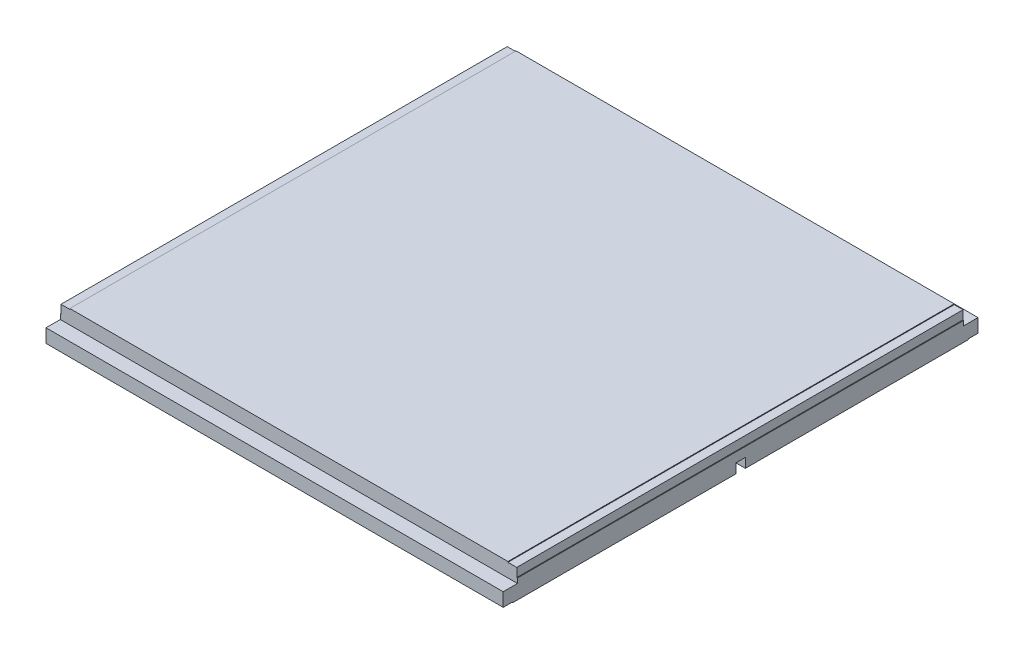
ISO-10303-21;
HEADER;
FILE_DESCRIPTION(('STEP AP214'),'2;1');
FILE_NAME('part.step','',(''),(''),'','','');
FILE_SCHEMA(('AUTOMOTIVE_DESIGN { 1 0 10303 214 1 1 1 1 }'));
ENDSEC;
DATA;
#1=APPLICATION_CONTEXT('core data for automotive mechanical design processes');
#2=APPLICATION_PROTOCOL_DEFINITION('international standard','automotive_design',2000,#1);
#3=PRODUCT_CONTEXT('',#1,'mechanical');
#4=PRODUCT('Part','Part','',(#3));
#5=PRODUCT_RELATED_PRODUCT_CATEGORY('part','',(#4));
#6=PRODUCT_DEFINITION_FORMATION('','',#4);
#7=PRODUCT_DEFINITION_CONTEXT('part definition',#1,'design');
#8=PRODUCT_DEFINITION('design','',#6,#7);
#9=PRODUCT_DEFINITION_SHAPE('','',#8);
#10=(LENGTH_UNIT() NAMED_UNIT(*) SI_UNIT(.MILLI.,.METRE.));
#11=(NAMED_UNIT(*) PLANE_ANGLE_UNIT() SI_UNIT($,.RADIAN.));
#12=(NAMED_UNIT(*) SI_UNIT($,.STERADIAN.) SOLID_ANGLE_UNIT());
#13=UNCERTAINTY_MEASURE_WITH_UNIT(LENGTH_MEASURE(1.E-05),#10,'distance_accuracy_value','');
#14=(GEOMETRIC_REPRESENTATION_CONTEXT(3) GLOBAL_UNCERTAINTY_ASSIGNED_CONTEXT((#13)) GLOBAL_UNIT_ASSIGNED_CONTEXT((#10,
#11,#12)) REPRESENTATION_CONTEXT('',''));
#15=CARTESIAN_POINT('',(0.,0.,0.));
#16=DIRECTION('',(0.,0.,1.));
#17=DIRECTION('',(1.,0.,0.));
#18=AXIS2_PLACEMENT_3D('',#15,#16,#17);
#19=CARTESIAN_POINT('',(960.,120.,-997.));
#20=DIRECTION('',(-1.,0.,0.));
#21=DIRECTION('',(0.,0.,1.));
#22=AXIS2_PLACEMENT_3D('',#19,#20,#21);
#23=PLANE('',#22);
#24=DIRECTION('',(0.,0.,1.));
#25=VECTOR('',#24,1.);
#26=CARTESIAN_POINT('',(960.,80.,937.000000000001));
#27=LINE('',#26,#25);
#28=CARTESIAN_POINT('',(960.,80.,-936.999999999999));
#29=VERTEX_POINT('',#28);
#30=CARTESIAN_POINT('',(960.,80.,937.000000000001));
#31=VERTEX_POINT('',#30);
#32=EDGE_CURVE('E216',#29,#31,#27,.T.);
#33=ORIENTED_EDGE('',*,*,#32,.T.);
#34=DIRECTION('',(0.,-1.,0.));
#35=VECTOR('',#34,1.);
#36=CARTESIAN_POINT('',(960.000000000001,120.,937.));
#37=LINE('',#36,#35);
#38=CARTESIAN_POINT('',(960.000000000001,60.,937.));
#39=VERTEX_POINT('',#38);
#40=EDGE_CURVE('E221',#31,#39,#37,.T.);
#41=ORIENTED_EDGE('',*,*,#40,.T.);
#42=DIRECTION('',(0.,0.,1.));
#43=VECTOR('',#42,1.);
#44=CARTESIAN_POINT('',(960.000000000001,60.,997.));
#45=LINE('',#44,#43);
#46=CARTESIAN_POINT('',(960.000000000001,60.,997.));
#47=VERTEX_POINT('',#46);
#48=EDGE_CURVE('E403',#39,#47,#45,.T.);
#49=ORIENTED_EDGE('',*,*,#48,.T.);
#50=DIRECTION('',(0.,-1.,0.));
#51=VECTOR('',#50,1.);
#52=CARTESIAN_POINT('',(960.,120.,997.));
#53=LINE('',#52,#51);
#54=CARTESIAN_POINT('',(960.,3.,997.));
#55=VERTEX_POINT('',#54);
#56=EDGE_CURVE('E438',#47,#55,#53,.T.);
#57=ORIENTED_EDGE('',*,*,#56,.T.);
#58=DIRECTION('',(0.,0.,1.));
#59=VECTOR('',#58,1.);
#60=CARTESIAN_POINT('',(960.,3.,957.000000000001));
#61=LINE('',#60,#59);
#62=CARTESIAN_POINT('',(960.,3.,957.000000000001));
#63=VERTEX_POINT('',#62);
#64=EDGE_CURVE('E323',#63,#55,#61,.T.);
#65=ORIENTED_EDGE('',*,*,#64,.F.);
#66=DIRECTION('',(0.,-1.,0.));
#67=VECTOR('',#66,1.);
#68=CARTESIAN_POINT('',(960.,3.,957.000000000001));
#69=LINE('',#68,#67);
#70=CARTESIAN_POINT('',(960.,0.,957.000000000001));
#71=VERTEX_POINT('',#70);
#72=EDGE_CURVE('E307',#63,#71,#69,.T.);
#73=ORIENTED_EDGE('',*,*,#72,.T.);
#74=DIRECTION('',(0.,0.,-1.));
#75=VECTOR('',#74,1.);
#76=CARTESIAN_POINT('',(960.,0.,-997.));
#77=LINE('',#76,#75);
#78=CARTESIAN_POINT('',(960.,0.,20.0000000000004));
#79=VERTEX_POINT('',#78);
#80=EDGE_CURVE('E427',#71,#79,#77,.T.);
#81=ORIENTED_EDGE('',*,*,#80,.T.);
#82=DIRECTION('',(0.,1.,0.));
#83=VECTOR('',#82,1.);
#84=CARTESIAN_POINT('',(960.000000000001,0.,20.0000000000003));
#85=LINE('',#84,#83);
#86=CARTESIAN_POINT('',(960.000000000001,40.,20.0000000000003));
#87=VERTEX_POINT('',#86);
#88=EDGE_CURVE('E340',#79,#87,#85,.T.);
#89=ORIENTED_EDGE('',*,*,#88,.T.);
#90=DIRECTION('',(0.,0.,1.));
#91=VECTOR('',#90,1.);
#92=CARTESIAN_POINT('',(960.000000000001,40.,-2.65554844650516E-13));
#93=LINE('',#92,#91);
#94=CARTESIAN_POINT('',(960.000000000001,40.,-19.9999999999997));
#95=VERTEX_POINT('',#94);
#96=EDGE_CURVE('E345',#95,#87,#93,.T.);
#97=ORIENTED_EDGE('',*,*,#96,.F.);
#98=DIRECTION('',(0.,1.,0.));
#99=VECTOR('',#98,1.);
#100=CARTESIAN_POINT('',(960.000000000001,0.,-19.9999999999997));
#101=LINE('',#100,#99);
#102=CARTESIAN_POINT('',(960.000000000001,0.,-19.9999999999997));
#103=VERTEX_POINT('',#102);
#104=EDGE_CURVE('E337',#103,#95,#101,.T.);
#105=ORIENTED_EDGE('',*,*,#104,.F.);
#106=CARTESIAN_POINT('',(960.,0.,-957.));
#107=VERTEX_POINT('',#106);
#108=EDGE_CURVE('E426',#103,#107,#77,.T.);
#109=ORIENTED_EDGE('',*,*,#108,.T.);
#110=DIRECTION('',(0.,-1.,0.));
#111=VECTOR('',#110,1.);
#112=CARTESIAN_POINT('',(960.,3.,-957.));
#113=LINE('',#112,#111);
#114=CARTESIAN_POINT('',(960.,3.,-957.));
#115=VERTEX_POINT('',#114);
#116=EDGE_CURVE('E304',#115,#107,#113,.T.);
#117=ORIENTED_EDGE('',*,*,#116,.F.);
#118=DIRECTION('',(0.,0.,1.));
#119=VECTOR('',#118,1.);
#120=CARTESIAN_POINT('',(960.,3.,-957.));
#121=LINE('',#120,#119);
#122=CARTESIAN_POINT('',(960.,3.,-997.));
#123=VERTEX_POINT('',#122);
#124=EDGE_CURVE('E289',#123,#115,#121,.T.);
#125=ORIENTED_EDGE('',*,*,#124,.F.);
#126=DIRECTION('',(0.,-1.,0.));
#127=VECTOR('',#126,1.);
#128=CARTESIAN_POINT('',(960.,120.,-997.));
#129=LINE('',#128,#127);
#130=CARTESIAN_POINT('',(960.,59.9999999999996,-997.));
#131=VERTEX_POINT('',#130);
#132=EDGE_CURVE('E434',#131,#123,#129,.T.);
#133=ORIENTED_EDGE('',*,*,#132,.F.);
#134=DIRECTION('',(0.,0.,1.));
#135=VECTOR('',#134,1.);
#136=CARTESIAN_POINT('',(960.,59.9999999999996,-997.));
#137=LINE('',#136,#135);
#138=CARTESIAN_POINT('',(960.,60.,-937.));
#139=VERTEX_POINT('',#138);
#140=EDGE_CURVE('E373',#131,#139,#137,.T.);
#141=ORIENTED_EDGE('',*,*,#140,.T.);
#142=DIRECTION('',(0.,1.,0.));
#143=VECTOR('',#142,1.);
#144=CARTESIAN_POINT('',(960.,120.,-937.));
#145=LINE('',#144,#143);
#146=EDGE_CURVE('E377',#139,#29,#145,.T.);
#147=ORIENTED_EDGE('',*,*,#146,.T.);
#148=EDGE_LOOP('',(#33,#41,#49,#57,#65,#73,#81,#89,#97,#105,#109,#117,#125,#133,#141,#147));
#149=FACE_BOUND('',#148,.T.);
#150=ADVANCED_FACE('F38',(#149),#23,.F.);
#151=CARTESIAN_POINT('',(960.000000000001,120.,937.));
#152=DIRECTION('',(0.,0.,-1.));
#153=DIRECTION('',(0.,1.,0.));
#154=AXIS2_PLACEMENT_3D('',#151,#152,#153);
#155=PLANE('',#154);
#156=DIRECTION('',(1.,0.,0.));
#157=VECTOR('',#156,1.);
#158=CARTESIAN_POINT('',(957.,80.,937.000000000001));
#159=LINE('',#158,#157);
#160=CARTESIAN_POINT('',(957.,80.,937.000000000001));
#161=VERTEX_POINT('',#160);
#162=EDGE_CURVE('E203',#161,#31,#159,.T.);
#163=ORIENTED_EDGE('',*,*,#162,.F.);
#164=DIRECTION('',(0.,1.,0.));
#165=VECTOR('',#164,1.);
#166=CARTESIAN_POINT('',(957.,120.,937.000000000001));
#167=LINE('',#166,#165);
#168=CARTESIAN_POINT('',(957.,117.,937.000000000001));
#169=VERTEX_POINT('',#168);
#170=EDGE_CURVE('E208',#161,#169,#167,.T.);
#171=ORIENTED_EDGE('',*,*,#170,.T.);
#172=DIRECTION('',(1.,0.,0.));
#173=VECTOR('',#172,1.);
#174=CARTESIAN_POINT('',(920.,117.,937.));
#175=LINE('',#174,#173);
#176=CARTESIAN_POINT('',(920.,117.,937.));
#177=VERTEX_POINT('',#176);
#178=EDGE_CURVE('E257',#177,#169,#175,.T.);
#179=ORIENTED_EDGE('',*,*,#178,.F.);
#180=DIRECTION('',(0.,1.,0.));
#181=VECTOR('',#180,1.);
#182=CARTESIAN_POINT('',(920.,117.,937.));
#183=LINE('',#182,#181);
#184=CARTESIAN_POINT('',(920.,120.,937.));
#185=VERTEX_POINT('',#184);
#186=EDGE_CURVE('E264',#177,#185,#183,.T.);
#187=ORIENTED_EDGE('',*,*,#186,.T.);
#188=DIRECTION('',(-1.,0.,0.));
#189=VECTOR('',#188,1.);
#190=CARTESIAN_POINT('',(960.000000000001,120.,937.));
#191=LINE('',#190,#189);
#192=CARTESIAN_POINT('',(-920.,120.,937.000000000001));
#193=VERTEX_POINT('',#192);
#194=EDGE_CURVE('E408',#185,#193,#191,.T.);
#195=ORIENTED_EDGE('',*,*,#194,.T.);
#196=DIRECTION('',(0.,1.,0.));
#197=VECTOR('',#196,1.);
#198=CARTESIAN_POINT('',(-920.,117.,937.000000000001));
#199=LINE('',#198,#197);
#200=CARTESIAN_POINT('',(-920.,117.,937.000000000001));
#201=VERTEX_POINT('',#200);
#202=EDGE_CURVE('E281',#201,#193,#199,.T.);
#203=ORIENTED_EDGE('',*,*,#202,.F.);
#204=DIRECTION('',(1.,0.,0.));
#205=VECTOR('',#204,1.);
#206=CARTESIAN_POINT('',(-960.,117.,937.000000000001));
#207=LINE('',#206,#205);
#208=CARTESIAN_POINT('',(-957.,117.,937.000000000001));
#209=VERTEX_POINT('',#208);
#210=EDGE_CURVE('E271',#209,#201,#207,.T.);
#211=ORIENTED_EDGE('',*,*,#210,.F.);
#212=DIRECTION('',(0.,1.,0.));
#213=VECTOR('',#212,1.);
#214=CARTESIAN_POINT('',(-957.,120.,937.000000000001));
#215=LINE('',#214,#213);
#216=CARTESIAN_POINT('',(-957.,80.,937.000000000001));
#217=VERTEX_POINT('',#216);
#218=EDGE_CURVE('E61',#217,#209,#215,.T.);
#219=ORIENTED_EDGE('',*,*,#218,.F.);
#220=DIRECTION('',(-1.,0.,0.));
#221=VECTOR('',#220,1.);
#222=CARTESIAN_POINT('',(-957.,80.,937.000000000001));
#223=LINE('',#222,#221);
#224=CARTESIAN_POINT('',(-960.,80.,937.000000000001));
#225=VERTEX_POINT('',#224);
#226=EDGE_CURVE('E242',#217,#225,#223,.T.);
#227=ORIENTED_EDGE('',*,*,#226,.T.);
#228=DIRECTION('',(0.,-1.,0.));
#229=VECTOR('',#228,1.);
#230=CARTESIAN_POINT('',(-960.,120.,937.000000000001));
#231=LINE('',#230,#229);
#232=CARTESIAN_POINT('',(-960.,60.,937.000000000001));
#233=VERTEX_POINT('',#232);
#234=EDGE_CURVE('E363',#225,#233,#231,.T.);
#235=ORIENTED_EDGE('',*,*,#234,.T.);
#236=DIRECTION('',(-1.,0.,0.));
#237=VECTOR('',#236,1.);
#238=CARTESIAN_POINT('',(960.000000000001,60.,937.));
#239=LINE('',#238,#237);
#240=EDGE_CURVE('E416',#39,#233,#239,.T.);
#241=ORIENTED_EDGE('',*,*,#240,.F.);
#242=ORIENTED_EDGE('',*,*,#40,.F.);
#243=EDGE_LOOP('',(#163,#171,#179,#187,#195,#203,#211,#219,#227,#235,#241,#242));
#244=FACE_BOUND('',#243,.T.);
#245=ADVANCED_FACE('F219',(#244),#155,.F.);
#246=CARTESIAN_POINT('',(960.,120.,-937.));
#247=DIRECTION('',(0.,0.,1.));
#248=DIRECTION('',(1.,0.,0.));
#249=AXIS2_PLACEMENT_3D('',#246,#247,#248);
#250=PLANE('',#249);
#251=DIRECTION('',(1.,0.,0.));
#252=VECTOR('',#251,1.);
#253=CARTESIAN_POINT('',(957.,80.,-936.999999999999));
#254=LINE('',#253,#252);
#255=CARTESIAN_POINT('',(957.,80.,-936.999999999999));
#256=VERTEX_POINT('',#255);
#257=EDGE_CURVE('E206',#256,#29,#254,.T.);
#258=ORIENTED_EDGE('',*,*,#257,.T.);
#259=ORIENTED_EDGE('',*,*,#146,.F.);
#260=DIRECTION('',(-1.,0.,0.));
#261=VECTOR('',#260,1.);
#262=CARTESIAN_POINT('',(960.,60.,-937.));
#263=LINE('',#262,#261);
#264=CARTESIAN_POINT('',(-960.,60.,-936.999999999999));
#265=VERTEX_POINT('',#264);
#266=EDGE_CURVE('E396',#139,#265,#263,.T.);
#267=ORIENTED_EDGE('',*,*,#266,.T.);
#268=DIRECTION('',(0.,1.,0.));
#269=VECTOR('',#268,1.);
#270=CARTESIAN_POINT('',(-960.,120.,-936.999999999999));
#271=LINE('',#270,#269);
#272=CARTESIAN_POINT('',(-960.,80.,-936.999999999999));
#273=VERTEX_POINT('',#272);
#274=EDGE_CURVE('E378',#265,#273,#271,.T.);
#275=ORIENTED_EDGE('',*,*,#274,.T.);
#276=DIRECTION('',(-1.,0.,0.));
#277=VECTOR('',#276,1.);
#278=CARTESIAN_POINT('',(-957.,80.,-936.999999999999));
#279=LINE('',#278,#277);
#280=CARTESIAN_POINT('',(-957.,80.,-936.999999999999));
#281=VERTEX_POINT('',#280);
#282=EDGE_CURVE('E239',#281,#273,#279,.T.);
#283=ORIENTED_EDGE('',*,*,#282,.F.);
#284=DIRECTION('',(0.,-1.,0.));
#285=VECTOR('',#284,1.);
#286=CARTESIAN_POINT('',(-957.,120.,-936.999999999999));
#287=LINE('',#286,#285);
#288=CARTESIAN_POINT('',(-957.,117.,-936.999999999999));
#289=VERTEX_POINT('',#288);
#290=EDGE_CURVE('E233',#289,#281,#287,.T.);
#291=ORIENTED_EDGE('',*,*,#290,.F.);
#292=DIRECTION('',(-1.,0.,0.));
#293=VECTOR('',#292,1.);
#294=CARTESIAN_POINT('',(-960.,117.,-936.999999999999));
#295=LINE('',#294,#293);
#296=CARTESIAN_POINT('',(-920.,117.,-936.999999999999));
#297=VERTEX_POINT('',#296);
#298=EDGE_CURVE('E277',#297,#289,#295,.T.);
#299=ORIENTED_EDGE('',*,*,#298,.F.);
#300=DIRECTION('',(0.,1.,0.));
#301=VECTOR('',#300,1.);
#302=CARTESIAN_POINT('',(-920.,117.,-936.999999999999));
#303=LINE('',#302,#301);
#304=CARTESIAN_POINT('',(-920.,120.,-936.999999999999));
#305=VERTEX_POINT('',#304);
#306=EDGE_CURVE('E263',#297,#305,#303,.T.);
#307=ORIENTED_EDGE('',*,*,#306,.T.);
#308=DIRECTION('',(-1.,0.,0.));
#309=VECTOR('',#308,1.);
#310=CARTESIAN_POINT('',(960.,120.,-937.));
#311=LINE('',#310,#309);
#312=CARTESIAN_POINT('',(920.,120.,-937.));
#313=VERTEX_POINT('',#312);
#314=EDGE_CURVE('E391',#313,#305,#311,.T.);
#315=ORIENTED_EDGE('',*,*,#314,.F.);
#316=DIRECTION('',(0.,1.,0.));
#317=VECTOR('',#316,1.);
#318=CARTESIAN_POINT('',(920.,117.,-937.));
#319=LINE('',#318,#317);
#320=CARTESIAN_POINT('',(920.,117.,-937.));
#321=VERTEX_POINT('',#320);
#322=EDGE_CURVE('E260',#321,#313,#319,.T.);
#323=ORIENTED_EDGE('',*,*,#322,.F.);
#324=DIRECTION('',(-1.,0.,0.));
#325=VECTOR('',#324,1.);
#326=CARTESIAN_POINT('',(920.,117.,-937.));
#327=LINE('',#326,#325);
#328=CARTESIAN_POINT('',(957.,117.,-937.));
#329=VERTEX_POINT('',#328);
#330=EDGE_CURVE('E249',#329,#321,#327,.T.);
#331=ORIENTED_EDGE('',*,*,#330,.F.);
#332=DIRECTION('',(0.,-1.,0.));
#333=VECTOR('',#332,1.);
#334=CARTESIAN_POINT('',(957.,120.,-936.999999999999));
#335=LINE('',#334,#333);
#336=EDGE_CURVE('E54',#329,#256,#335,.T.);
#337=ORIENTED_EDGE('',*,*,#336,.T.);
#338=EDGE_LOOP('',(#258,#259,#267,#275,#283,#291,#299,#307,#315,#323,#331,#337));
#339=FACE_BOUND('',#338,.T.);
#340=ADVANCED_FACE('F454',(#339),#250,.F.);
#341=CARTESIAN_POINT('',(-960.,120.,-996.999999999999));
#342=DIRECTION('',(1.,0.,0.));
#343=DIRECTION('',(0.,0.,-1.));
#344=AXIS2_PLACEMENT_3D('',#341,#342,#343);
#345=PLANE('',#344);
#346=ORIENTED_EDGE('',*,*,#234,.F.);
#347=DIRECTION('',(0.,0.,1.));
#348=VECTOR('',#347,1.);
#349=CARTESIAN_POINT('',(-960.,80.,937.000000000001));
#350=LINE('',#349,#348);
#351=EDGE_CURVE('E226',#273,#225,#350,.T.);
#352=ORIENTED_EDGE('',*,*,#351,.F.);
#353=ORIENTED_EDGE('',*,*,#274,.F.);
#354=DIRECTION('',(0.,0.,1.));
#355=VECTOR('',#354,1.);
#356=CARTESIAN_POINT('',(-960.,59.9999999999996,-996.999999999999));
#357=LINE('',#356,#355);
#358=CARTESIAN_POINT('',(-960.,59.9999999999996,-996.999999999999));
#359=VERTEX_POINT('',#358);
#360=EDGE_CURVE('E383',#359,#265,#357,.T.);
#361=ORIENTED_EDGE('',*,*,#360,.F.);
#362=DIRECTION('',(0.,-1.,0.));
#363=VECTOR('',#362,1.);
#364=CARTESIAN_POINT('',(-960.,120.,-996.999999999999));
#365=LINE('',#364,#363);
#366=CARTESIAN_POINT('',(-960.,3.,-996.999999999999));
#367=VERTEX_POINT('',#366);
#368=EDGE_CURVE('E430',#359,#367,#365,.T.);
#369=ORIENTED_EDGE('',*,*,#368,.T.);
#370=DIRECTION('',(0.,0.,-1.));
#371=VECTOR('',#370,1.);
#372=CARTESIAN_POINT('',(-960.,3.,-957.));
#373=LINE('',#372,#371);
#374=CARTESIAN_POINT('',(-960.,3.,-957.));
#375=VERTEX_POINT('',#374);
#376=EDGE_CURVE('E298',#375,#367,#373,.T.);
#377=ORIENTED_EDGE('',*,*,#376,.F.);
#378=DIRECTION('',(0.,-1.,0.));
#379=VECTOR('',#378,1.);
#380=CARTESIAN_POINT('',(-960.,3.,-957.));
#381=LINE('',#380,#379);
#382=CARTESIAN_POINT('',(-960.,0.,-957.));
#383=VERTEX_POINT('',#382);
#384=EDGE_CURVE('E308',#375,#383,#381,.T.);
#385=ORIENTED_EDGE('',*,*,#384,.T.);
#386=DIRECTION('',(0.,0.,1.));
#387=VECTOR('',#386,1.);
#388=CARTESIAN_POINT('',(-960.,0.,-996.999999999999));
#389=LINE('',#388,#387);
#390=CARTESIAN_POINT('',(-960.,0.,-19.9999999999992));
#391=VERTEX_POINT('',#390);
#392=EDGE_CURVE('E423',#383,#391,#389,.T.);
#393=ORIENTED_EDGE('',*,*,#392,.T.);
#394=DIRECTION('',(0.,1.,0.));
#395=VECTOR('',#394,1.);
#396=CARTESIAN_POINT('',(-960.,0.,-19.9999999999992));
#397=LINE('',#396,#395);
#398=CARTESIAN_POINT('',(-960.,40.,-19.9999999999992));
#399=VERTEX_POINT('',#398);
#400=EDGE_CURVE('E312',#391,#399,#397,.T.);
#401=ORIENTED_EDGE('',*,*,#400,.T.);
#402=DIRECTION('',(0.,0.,1.));
#403=VECTOR('',#402,1.);
#404=CARTESIAN_POINT('',(-960.,40.,2.68955738920271E-13));
#405=LINE('',#404,#403);
#406=CARTESIAN_POINT('',(-960.,40.,20.0000000000008));
#407=VERTEX_POINT('',#406);
#408=EDGE_CURVE('E341',#399,#407,#405,.T.);
#409=ORIENTED_EDGE('',*,*,#408,.T.);
#410=DIRECTION('',(0.,1.,0.));
#411=VECTOR('',#410,1.);
#412=CARTESIAN_POINT('',(-960.,0.,20.0000000000008));
#413=LINE('',#412,#411);
#414=CARTESIAN_POINT('',(-960.,0.,20.0000000000008));
#415=VERTEX_POINT('',#414);
#416=EDGE_CURVE('E352',#415,#407,#413,.T.);
#417=ORIENTED_EDGE('',*,*,#416,.F.);
#418=CARTESIAN_POINT('',(-960.,0.,957.000000000001));
#419=VERTEX_POINT('',#418);
#420=EDGE_CURVE('E395',#415,#419,#389,.T.);
#421=ORIENTED_EDGE('',*,*,#420,.T.);
#422=DIRECTION('',(0.,-1.,0.));
#423=VECTOR('',#422,1.);
#424=CARTESIAN_POINT('',(-960.,3.,957.000000000001));
#425=LINE('',#424,#423);
#426=CARTESIAN_POINT('',(-960.,3.,957.000000000001));
#427=VERTEX_POINT('',#426);
#428=EDGE_CURVE('E329',#427,#419,#425,.T.);
#429=ORIENTED_EDGE('',*,*,#428,.F.);
#430=DIRECTION('',(0.,0.,-1.));
#431=VECTOR('',#430,1.);
#432=CARTESIAN_POINT('',(-960.,3.,957.000000000001));
#433=LINE('',#432,#431);
#434=CARTESIAN_POINT('',(-960.,3.,997.000000000001));
#435=VERTEX_POINT('',#434);
#436=EDGE_CURVE('E315',#435,#427,#433,.T.);
#437=ORIENTED_EDGE('',*,*,#436,.F.);
#438=DIRECTION('',(0.,-1.,0.));
#439=VECTOR('',#438,1.);
#440=CARTESIAN_POINT('',(-960.,120.,997.000000000001));
#441=LINE('',#440,#439);
#442=CARTESIAN_POINT('',(-960.,60.,997.000000000001));
#443=VERTEX_POINT('',#442);
#444=EDGE_CURVE('E442',#443,#435,#441,.T.);
#445=ORIENTED_EDGE('',*,*,#444,.F.);
#446=DIRECTION('',(0.,0.,1.));
#447=VECTOR('',#446,1.);
#448=CARTESIAN_POINT('',(-960.,60.,997.000000000001));
#449=LINE('',#448,#447);
#450=EDGE_CURVE('E404',#233,#443,#449,.T.);
#451=ORIENTED_EDGE('',*,*,#450,.F.);
#452=EDGE_LOOP('',(#346,#352,#353,#361,#369,#377,#385,#393,#401,#409,#417,#421,#429,#437,#445,#451));
#453=FACE_BOUND('',#452,.T.);
#454=ADVANCED_FACE('F40',(#453),#345,.F.);
#455=CARTESIAN_POINT('',(0.,0.,0.));
#456=DIRECTION('',(0.,-1.,0.));
#457=DIRECTION('',(0.,0.,-1.));
#458=AXIS2_PLACEMENT_3D('',#455,#456,#457);
#459=PLANE('',#458);
#460=DIRECTION('',(-1.,0.,0.));
#461=VECTOR('',#460,1.);
#462=CARTESIAN_POINT('',(960.,0.,-957.));
#463=LINE('',#462,#461);
#464=EDGE_CURVE('E294',#107,#383,#463,.T.);
#465=ORIENTED_EDGE('',*,*,#464,.F.);
#466=ORIENTED_EDGE('',*,*,#108,.F.);
#467=DIRECTION('',(-1.,0.,0.));
#468=VECTOR('',#467,1.);
#469=CARTESIAN_POINT('',(960.000000000001,0.,-19.9999999999997));
#470=LINE('',#469,#468);
#471=EDGE_CURVE('E348',#103,#391,#470,.T.);
#472=ORIENTED_EDGE('',*,*,#471,.T.);
#473=ORIENTED_EDGE('',*,*,#392,.F.);
#474=EDGE_LOOP('',(#465,#466,#472,#473));
#475=FACE_BOUND('',#474,.T.);
#476=ADVANCED_FACE('F526',(#475),#459,.T.);
#477=CARTESIAN_POINT('',(960.,120.,997.));
#478=DIRECTION('',(0.,0.,-1.));
#479=DIRECTION('',(-1.,0.,0.));
#480=AXIS2_PLACEMENT_3D('',#477,#478,#479);
#481=PLANE('',#480);
#482=ORIENTED_EDGE('',*,*,#444,.T.);
#483=DIRECTION('',(-1.,0.,0.));
#484=VECTOR('',#483,1.);
#485=CARTESIAN_POINT('',(-960.,3.,997.000000000001));
#486=LINE('',#485,#484);
#487=EDGE_CURVE('E326',#55,#435,#486,.T.);
#488=ORIENTED_EDGE('',*,*,#487,.F.);
#489=ORIENTED_EDGE('',*,*,#56,.F.);
#490=DIRECTION('',(-1.,0.,0.));
#491=VECTOR('',#490,1.);
#492=CARTESIAN_POINT('',(960.000000000001,60.,997.));
#493=LINE('',#492,#491);
#494=EDGE_CURVE('E387',#47,#443,#493,.T.);
#495=ORIENTED_EDGE('',*,*,#494,.T.);
#496=EDGE_LOOP('',(#482,#488,#489,#495));
#497=FACE_BOUND('',#496,.T.);
#498=ADVANCED_FACE('F502',(#497),#481,.F.);
#499=CARTESIAN_POINT('',(960.,120.,-997.));
#500=DIRECTION('',(0.,0.,1.));
#501=DIRECTION('',(1.,0.,0.));
#502=AXIS2_PLACEMENT_3D('',#499,#500,#501);
#503=PLANE('',#502);
#504=ORIENTED_EDGE('',*,*,#132,.T.);
#505=DIRECTION('',(1.,0.,0.));
#506=VECTOR('',#505,1.);
#507=CARTESIAN_POINT('',(960.,3.,-997.));
#508=LINE('',#507,#506);
#509=EDGE_CURVE('E301',#367,#123,#508,.T.);
#510=ORIENTED_EDGE('',*,*,#509,.F.);
#511=ORIENTED_EDGE('',*,*,#368,.F.);
#512=DIRECTION('',(-1.,0.,0.));
#513=VECTOR('',#512,1.);
#514=CARTESIAN_POINT('',(960.,59.9999999999996,-997.));
#515=LINE('',#514,#513);
#516=EDGE_CURVE('E382',#131,#359,#515,.T.);
#517=ORIENTED_EDGE('',*,*,#516,.F.);
#518=EDGE_LOOP('',(#504,#510,#511,#517));
#519=FACE_BOUND('',#518,.T.);
#520=ADVANCED_FACE('F484',(#519),#503,.F.);
#521=CARTESIAN_POINT('',(0.,120.,0.));
#522=DIRECTION('',(0.,-1.,0.));
#523=DIRECTION('',(0.,0.,-1.));
#524=AXIS2_PLACEMENT_3D('',#521,#522,#523);
#525=PLANE('',#524);
#526=ORIENTED_EDGE('',*,*,#194,.F.);
#527=DIRECTION('',(0.,0.,1.));
#528=VECTOR('',#527,1.);
#529=CARTESIAN_POINT('',(920.,120.,937.));
#530=LINE('',#529,#528);
#531=EDGE_CURVE('E253',#313,#185,#530,.T.);
#532=ORIENTED_EDGE('',*,*,#531,.F.);
#533=ORIENTED_EDGE('',*,*,#314,.T.);
#534=DIRECTION('',(0.,0.,-1.));
#535=VECTOR('',#534,1.);
#536=CARTESIAN_POINT('',(-920.,120.,-936.999999999999));
#537=LINE('',#536,#535);
#538=EDGE_CURVE('E246',#193,#305,#537,.T.);
#539=ORIENTED_EDGE('',*,*,#538,.F.);
#540=EDGE_LOOP('',(#526,#532,#533,#539));
#541=FACE_BOUND('',#540,.T.);
#542=ADVANCED_FACE('F467',(#541),#525,.F.);
#543=DIRECTION('',(1.,0.,0.));
#544=VECTOR('',#543,1.);
#545=CARTESIAN_POINT('',(-960.,0.,957.000000000001));
#546=LINE('',#545,#544);
#547=EDGE_CURVE('E268',#419,#71,#546,.T.);
#548=ORIENTED_EDGE('',*,*,#547,.F.);
#549=ORIENTED_EDGE('',*,*,#420,.F.);
#550=DIRECTION('',(-1.,0.,0.));
#551=VECTOR('',#550,1.);
#552=CARTESIAN_POINT('',(960.000000000001,0.,20.0000000000003));
#553=LINE('',#552,#551);
#554=EDGE_CURVE('E367',#79,#415,#553,.T.);
#555=ORIENTED_EDGE('',*,*,#554,.F.);
#556=ORIENTED_EDGE('',*,*,#80,.F.);
#557=EDGE_LOOP('',(#548,#549,#555,#556));
#558=FACE_BOUND('',#557,.T.);
#559=ADVANCED_FACE('F514',(#558),#459,.T.);
#560=CARTESIAN_POINT('',(960.000000000001,60.,997.));
#561=DIRECTION('',(0.,-1.,0.));
#562=DIRECTION('',(0.,0.,-1.));
#563=AXIS2_PLACEMENT_3D('',#560,#561,#562);
#564=PLANE('',#563);
#565=ORIENTED_EDGE('',*,*,#450,.T.);
#566=ORIENTED_EDGE('',*,*,#494,.F.);
#567=ORIENTED_EDGE('',*,*,#48,.F.);
#568=ORIENTED_EDGE('',*,*,#240,.T.);
#569=EDGE_LOOP('',(#565,#566,#567,#568));
#570=FACE_BOUND('',#569,.T.);
#571=ADVANCED_FACE('F496',(#570),#564,.F.);
#572=CARTESIAN_POINT('',(960.,59.9999999999996,-997.));
#573=DIRECTION('',(0.,-1.,0.));
#574=DIRECTION('',(0.,0.,-1.));
#575=AXIS2_PLACEMENT_3D('',#572,#573,#574);
#576=PLANE('',#575);
#577=ORIENTED_EDGE('',*,*,#360,.T.);
#578=ORIENTED_EDGE('',*,*,#266,.F.);
#579=ORIENTED_EDGE('',*,*,#140,.F.);
#580=ORIENTED_EDGE('',*,*,#516,.T.);
#581=EDGE_LOOP('',(#577,#578,#579,#580));
#582=FACE_BOUND('',#581,.T.);
#583=ADVANCED_FACE('F480',(#582),#576,.F.);
#584=CARTESIAN_POINT('',(960.000000000001,0.,-19.9999999999997));
#585=DIRECTION('',(0.,0.,1.));
#586=DIRECTION('',(1.,0.,0.));
#587=AXIS2_PLACEMENT_3D('',#584,#585,#586);
#588=PLANE('',#587);
#589=ORIENTED_EDGE('',*,*,#400,.F.);
#590=ORIENTED_EDGE('',*,*,#471,.F.);
#591=ORIENTED_EDGE('',*,*,#104,.T.);
#592=DIRECTION('',(-1.,0.,0.));
#593=VECTOR('',#592,1.);
#594=CARTESIAN_POINT('',(960.000000000001,40.,-19.9999999999997));
#595=LINE('',#594,#593);
#596=EDGE_CURVE('E359',#95,#399,#595,.T.);
#597=ORIENTED_EDGE('',*,*,#596,.T.);
#598=EDGE_LOOP('',(#589,#590,#591,#597));
#599=FACE_BOUND('',#598,.T.);
#600=ADVANCED_FACE('F532',(#599),#588,.T.);
#601=CARTESIAN_POINT('',(960.000000000001,40.,-2.65554844650516E-13));
#602=DIRECTION('',(0.,-1.,0.));
#603=DIRECTION('',(0.,0.,-1.));
#604=AXIS2_PLACEMENT_3D('',#601,#602,#603);
#605=PLANE('',#604);
#606=ORIENTED_EDGE('',*,*,#408,.F.);
#607=ORIENTED_EDGE('',*,*,#596,.F.);
#608=ORIENTED_EDGE('',*,*,#96,.T.);
#609=DIRECTION('',(-1.,0.,0.));
#610=VECTOR('',#609,1.);
#611=CARTESIAN_POINT('',(960.000000000001,40.,20.0000000000003));
#612=LINE('',#611,#610);
#613=EDGE_CURVE('E364',#87,#407,#612,.T.);
#614=ORIENTED_EDGE('',*,*,#613,.T.);
#615=EDGE_LOOP('',(#606,#607,#608,#614));
#616=FACE_BOUND('',#615,.T.);
#617=ADVANCED_FACE('F535',(#616),#605,.T.);
#618=CARTESIAN_POINT('',(960.000000000001,0.,20.0000000000003));
#619=DIRECTION('',(0.,0.,1.));
#620=DIRECTION('',(1.,0.,0.));
#621=AXIS2_PLACEMENT_3D('',#618,#619,#620);
#622=PLANE('',#621);
#623=ORIENTED_EDGE('',*,*,#416,.T.);
#624=ORIENTED_EDGE('',*,*,#613,.F.);
#625=ORIENTED_EDGE('',*,*,#88,.F.);
#626=ORIENTED_EDGE('',*,*,#554,.T.);
#627=EDGE_LOOP('',(#623,#624,#625,#626));
#628=FACE_BOUND('',#627,.T.);
#629=ADVANCED_FACE('F539',(#628),#622,.F.);
#630=CARTESIAN_POINT('',(-960.,3.,957.000000000001));
#631=DIRECTION('',(0.,0.,-1.));
#632=DIRECTION('',(-1.,0.,0.));
#633=AXIS2_PLACEMENT_3D('',#630,#631,#632);
#634=PLANE('',#633);
#635=ORIENTED_EDGE('',*,*,#547,.T.);
#636=ORIENTED_EDGE('',*,*,#72,.F.);
#637=DIRECTION('',(1.,0.,0.));
#638=VECTOR('',#637,1.);
#639=CARTESIAN_POINT('',(-960.,3.,957.000000000001));
#640=LINE('',#639,#638);
#641=EDGE_CURVE('E319',#427,#63,#640,.T.);
#642=ORIENTED_EDGE('',*,*,#641,.F.);
#643=ORIENTED_EDGE('',*,*,#428,.T.);
#644=EDGE_LOOP('',(#635,#636,#642,#643));
#645=FACE_BOUND('',#644,.T.);
#646=ADVANCED_FACE('F509',(#645),#634,.F.);
#647=CARTESIAN_POINT('',(0.,3.,0.));
#648=DIRECTION('',(0.,1.,0.));
#649=DIRECTION('',(0.,0.,1.));
#650=AXIS2_PLACEMENT_3D('',#647,#648,#649);
#651=PLANE('',#650);
#652=ORIENTED_EDGE('',*,*,#436,.T.);
#653=ORIENTED_EDGE('',*,*,#641,.T.);
#654=ORIENTED_EDGE('',*,*,#64,.T.);
#655=ORIENTED_EDGE('',*,*,#487,.T.);
#656=EDGE_LOOP('',(#652,#653,#654,#655));
#657=FACE_BOUND('',#656,.T.);
#658=ADVANCED_FACE('F507',(#657),#651,.F.);
#659=CARTESIAN_POINT('',(960.,3.,-957.));
#660=DIRECTION('',(0.,0.,1.));
#661=DIRECTION('',(1.,0.,0.));
#662=AXIS2_PLACEMENT_3D('',#659,#660,#661);
#663=PLANE('',#662);
#664=ORIENTED_EDGE('',*,*,#464,.T.);
#665=ORIENTED_EDGE('',*,*,#384,.F.);
#666=DIRECTION('',(-1.,0.,0.));
#667=VECTOR('',#666,1.);
#668=CARTESIAN_POINT('',(960.,3.,-957.));
#669=LINE('',#668,#667);
#670=EDGE_CURVE('E293',#115,#375,#669,.T.);
#671=ORIENTED_EDGE('',*,*,#670,.F.);
#672=ORIENTED_EDGE('',*,*,#116,.T.);
#673=EDGE_LOOP('',(#664,#665,#671,#672));
#674=FACE_BOUND('',#673,.T.);
#675=ADVANCED_FACE('F529',(#674),#663,.F.);
#676=CARTESIAN_POINT('',(0.,3.,0.));
#677=DIRECTION('',(0.,1.,0.));
#678=DIRECTION('',(0.,0.,1.));
#679=AXIS2_PLACEMENT_3D('',#676,#677,#678);
#680=PLANE('',#679);
#681=ORIENTED_EDGE('',*,*,#124,.T.);
#682=ORIENTED_EDGE('',*,*,#670,.T.);
#683=ORIENTED_EDGE('',*,*,#376,.T.);
#684=ORIENTED_EDGE('',*,*,#509,.T.);
#685=EDGE_LOOP('',(#681,#682,#683,#684));
#686=FACE_BOUND('',#685,.T.);
#687=ADVANCED_FACE('F618',(#686),#680,.F.);
#688=CARTESIAN_POINT('',(-920.,117.,-936.999999999999));
#689=DIRECTION('',(1.,0.,0.));
#690=DIRECTION('',(0.,0.,-1.));
#691=AXIS2_PLACEMENT_3D('',#688,#689,#690);
#692=PLANE('',#691);
#693=ORIENTED_EDGE('',*,*,#538,.T.);
#694=ORIENTED_EDGE('',*,*,#306,.F.);
#695=DIRECTION('',(0.,0.,-1.));
#696=VECTOR('',#695,1.);
#697=CARTESIAN_POINT('',(-920.,117.,-936.999999999999));
#698=LINE('',#697,#696);
#699=EDGE_CURVE('E274',#201,#297,#698,.T.);
#700=ORIENTED_EDGE('',*,*,#699,.F.);
#701=ORIENTED_EDGE('',*,*,#202,.T.);
#702=EDGE_LOOP('',(#693,#694,#700,#701));
#703=FACE_BOUND('',#702,.T.);
#704=ADVANCED_FACE('F460',(#703),#692,.F.);
#705=CARTESIAN_POINT('',(0.,117.,0.));
#706=DIRECTION('',(0.,1.,0.));
#707=DIRECTION('',(0.,0.,1.));
#708=AXIS2_PLACEMENT_3D('',#705,#706,#707);
#709=PLANE('',#708);
#710=DIRECTION('',(0.,0.,-1.));
#711=VECTOR('',#710,1.);
#712=CARTESIAN_POINT('',(-957.,117.,2.26784084219055E-13));
#713=LINE('',#712,#711);
#714=EDGE_CURVE('E47',#209,#289,#713,.T.);
#715=ORIENTED_EDGE('',*,*,#714,.F.);
#716=ORIENTED_EDGE('',*,*,#210,.T.);
#717=ORIENTED_EDGE('',*,*,#699,.T.);
#718=ORIENTED_EDGE('',*,*,#298,.T.);
#719=EDGE_LOOP('',(#715,#716,#717,#718));
#720=FACE_BOUND('',#719,.T.);
#721=ADVANCED_FACE('F455',(#720),#709,.T.);
#722=CARTESIAN_POINT('',(920.,117.,937.));
#723=DIRECTION('',(-1.,0.,0.));
#724=DIRECTION('',(0.,0.,1.));
#725=AXIS2_PLACEMENT_3D('',#722,#723,#724);
#726=PLANE('',#725);
#727=ORIENTED_EDGE('',*,*,#531,.T.);
#728=ORIENTED_EDGE('',*,*,#186,.F.);
#729=DIRECTION('',(0.,0.,1.));
#730=VECTOR('',#729,1.);
#731=CARTESIAN_POINT('',(920.,117.,937.));
#732=LINE('',#731,#730);
#733=EDGE_CURVE('E252',#321,#177,#732,.T.);
#734=ORIENTED_EDGE('',*,*,#733,.F.);
#735=ORIENTED_EDGE('',*,*,#322,.T.);
#736=EDGE_LOOP('',(#727,#728,#734,#735));
#737=FACE_BOUND('',#736,.T.);
#738=ADVANCED_FACE('F469',(#737),#726,.F.);
#739=CARTESIAN_POINT('',(0.,117.,0.));
#740=DIRECTION('',(0.,-1.,0.));
#741=DIRECTION('',(0.,0.,-1.));
#742=AXIS2_PLACEMENT_3D('',#739,#740,#741);
#743=PLANE('',#742);
#744=ORIENTED_EDGE('',*,*,#178,.T.);
#745=DIRECTION('',(0.,0.,-1.));
#746=VECTOR('',#745,1.);
#747=CARTESIAN_POINT('',(957.,117.,2.26784084219055E-13));
#748=LINE('',#747,#746);
#749=EDGE_CURVE('E11',#169,#329,#748,.T.);
#750=ORIENTED_EDGE('',*,*,#749,.T.);
#751=ORIENTED_EDGE('',*,*,#330,.T.);
#752=ORIENTED_EDGE('',*,*,#733,.T.);
#753=EDGE_LOOP('',(#744,#750,#751,#752));
#754=FACE_BOUND('',#753,.T.);
#755=ADVANCED_FACE('F472',(#754),#743,.F.);
#756=CARTESIAN_POINT('',(-957.,80.,937.000000000001));
#757=DIRECTION('',(0.,-1.,0.));
#758=DIRECTION('',(0.,0.,-1.));
#759=AXIS2_PLACEMENT_3D('',#756,#757,#758);
#760=PLANE('',#759);
#761=ORIENTED_EDGE('',*,*,#351,.T.);
#762=ORIENTED_EDGE('',*,*,#226,.F.);
#763=DIRECTION('',(0.,0.,1.));
#764=VECTOR('',#763,1.);
#765=CARTESIAN_POINT('',(-957.,80.,937.000000000001));
#766=LINE('',#765,#764);
#767=EDGE_CURVE('E236',#281,#217,#766,.T.);
#768=ORIENTED_EDGE('',*,*,#767,.F.);
#769=ORIENTED_EDGE('',*,*,#282,.T.);
#770=EDGE_LOOP('',(#761,#762,#768,#769));
#771=FACE_BOUND('',#770,.T.);
#772=ADVANCED_FACE('F493',(#771),#760,.F.);
#773=CARTESIAN_POINT('',(-957.,0.,2.2665983332633E-13));
#774=DIRECTION('',(1.,0.,0.));
#775=DIRECTION('',(0.,0.,-1.));
#776=AXIS2_PLACEMENT_3D('',#773,#774,#775);
#777=PLANE('',#776);
#778=ORIENTED_EDGE('',*,*,#714,.T.);
#779=ORIENTED_EDGE('',*,*,#290,.T.);
#780=ORIENTED_EDGE('',*,*,#767,.T.);
#781=ORIENTED_EDGE('',*,*,#218,.T.);
#782=EDGE_LOOP('',(#778,#779,#780,#781));
#783=FACE_BOUND('',#782,.T.);
#784=ADVANCED_FACE('F447',(#783),#777,.F.);
#785=CARTESIAN_POINT('',(957.,0.,2.2665983332633E-13));
#786=DIRECTION('',(-1.,0.,0.));
#787=DIRECTION('',(0.,0.,-1.));
#788=AXIS2_PLACEMENT_3D('',#785,#786,#787);
#789=PLANE('',#788);
#790=ORIENTED_EDGE('',*,*,#170,.F.);
#791=DIRECTION('',(0.,0.,1.));
#792=VECTOR('',#791,1.);
#793=CARTESIAN_POINT('',(957.,80.,937.000000000001));
#794=LINE('',#793,#792);
#795=EDGE_CURVE('E199',#256,#161,#794,.T.);
#796=ORIENTED_EDGE('',*,*,#795,.F.);
#797=ORIENTED_EDGE('',*,*,#336,.F.);
#798=ORIENTED_EDGE('',*,*,#749,.F.);
#799=EDGE_LOOP('',(#790,#796,#797,#798));
#800=FACE_BOUND('',#799,.T.);
#801=ADVANCED_FACE('F211',(#800),#789,.F.);
#802=CARTESIAN_POINT('',(957.,80.,937.000000000001));
#803=DIRECTION('',(0.,1.,0.));
#804=DIRECTION('',(0.,0.,1.));
#805=AXIS2_PLACEMENT_3D('',#802,#803,#804);
#806=PLANE('',#805);
#807=ORIENTED_EDGE('',*,*,#32,.F.);
#808=ORIENTED_EDGE('',*,*,#257,.F.);
#809=ORIENTED_EDGE('',*,*,#795,.T.);
#810=ORIENTED_EDGE('',*,*,#162,.T.);
#811=EDGE_LOOP('',(#807,#808,#809,#810));
#812=FACE_BOUND('',#811,.T.);
#813=ADVANCED_FACE('F201',(#812),#806,.T.);
#814=CLOSED_SHELL('',(#150,#245,#340,#454,#476,#498,#520,#542,#559,#571,#583,#600,#617,#629,
#646,#658,#675,#687,#704,#721,#738,#755,#772,#784,#801,#813));
#815=MANIFOLD_SOLID_BREP('B2',#814);
#816=ADVANCED_BREP_SHAPE_REPRESENTATION('',(#18,#815),#14);
#817=SHAPE_DEFINITION_REPRESENTATION(#9,#816);
ENDSEC;
END-ISO-10303-21;
